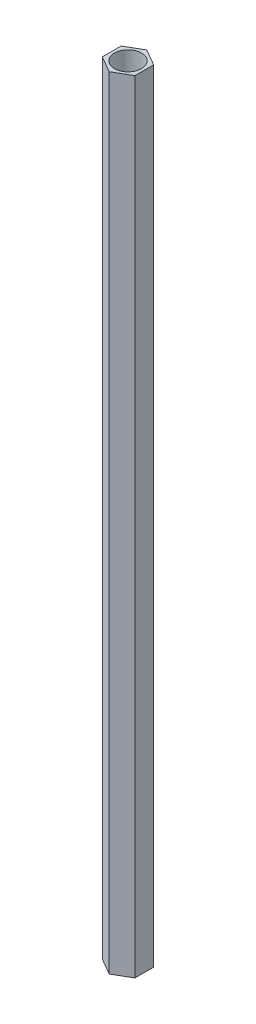
ISO-10303-21;
HEADER;
FILE_DESCRIPTION(('STEP AP214'),'2;1');
FILE_NAME('part.step','',(''),(''),'','','');
FILE_SCHEMA(('AUTOMOTIVE_DESIGN { 1 0 10303 214 1 1 1 1 }'));
ENDSEC;
DATA;
#1=APPLICATION_CONTEXT('core data for automotive mechanical design processes');
#2=APPLICATION_PROTOCOL_DEFINITION('international standard','automotive_design',2000,#1);
#3=PRODUCT_CONTEXT('',#1,'mechanical');
#4=PRODUCT('Part','Part','',(#3));
#5=PRODUCT_RELATED_PRODUCT_CATEGORY('part','',(#4));
#6=PRODUCT_DEFINITION_FORMATION('','',#4);
#7=PRODUCT_DEFINITION_CONTEXT('part definition',#1,'design');
#8=PRODUCT_DEFINITION('design','',#6,#7);
#9=PRODUCT_DEFINITION_SHAPE('','',#8);
#10=(LENGTH_UNIT() NAMED_UNIT(*) SI_UNIT(.MILLI.,.METRE.));
#11=(NAMED_UNIT(*) PLANE_ANGLE_UNIT() SI_UNIT($,.RADIAN.));
#12=(NAMED_UNIT(*) SI_UNIT($,.STERADIAN.) SOLID_ANGLE_UNIT());
#13=UNCERTAINTY_MEASURE_WITH_UNIT(LENGTH_MEASURE(1.E-05),#10,'distance_accuracy_value','');
#14=(GEOMETRIC_REPRESENTATION_CONTEXT(3) GLOBAL_UNCERTAINTY_ASSIGNED_CONTEXT((#13)) GLOBAL_UNIT_ASSIGNED_CONTEXT((#10,
#11,#12)) REPRESENTATION_CONTEXT('',''));
#15=CARTESIAN_POINT('',(0.,0.,0.));
#16=DIRECTION('',(0.,0.,1.));
#17=DIRECTION('',(1.,0.,0.));
#18=AXIS2_PLACEMENT_3D('',#15,#16,#17);
#19=CARTESIAN_POINT('',(1.5,72.,-0.86602540378444));
#20=DIRECTION('',(-0.5,0.,0.866025403784439));
#21=DIRECTION('',(0.866025403784439,0.,0.5));
#22=AXIS2_PLACEMENT_3D('',#19,#20,#21);
#23=PLANE('',#22);
#24=DIRECTION('',(-0.866025403784439,0.,-0.5));
#25=VECTOR('',#24,1.);
#26=CARTESIAN_POINT('',(1.5,0.,-0.86602540378444));
#27=LINE('',#26,#25);
#28=CARTESIAN_POINT('',(1.5,0.,-0.86602540378444));
#29=VERTEX_POINT('',#28);
#30=CARTESIAN_POINT('',(0.,0.,-1.73205080756888));
#31=VERTEX_POINT('',#30);
#32=EDGE_CURVE('E124',#29,#31,#27,.T.);
#33=ORIENTED_EDGE('',*,*,#32,.T.);
#34=DIRECTION('',(0.,-1.,0.));
#35=VECTOR('',#34,1.);
#36=CARTESIAN_POINT('',(0.,72.,-1.73205080756888));
#37=LINE('',#36,#35);
#38=CARTESIAN_POINT('',(0.,72.,-1.73205080756888));
#39=VERTEX_POINT('',#38);
#40=EDGE_CURVE('E11',#39,#31,#37,.T.);
#41=ORIENTED_EDGE('',*,*,#40,.F.);
#42=DIRECTION('',(-0.866025403784439,0.,-0.5));
#43=VECTOR('',#42,1.);
#44=CARTESIAN_POINT('',(1.5,72.,-0.86602540378444));
#45=LINE('',#44,#43);
#46=CARTESIAN_POINT('',(1.5,72.,-0.86602540378444));
#47=VERTEX_POINT('',#46);
#48=EDGE_CURVE('E135',#47,#39,#45,.T.);
#49=ORIENTED_EDGE('',*,*,#48,.F.);
#50=DIRECTION('',(0.,-1.,0.));
#51=VECTOR('',#50,1.);
#52=CARTESIAN_POINT('',(1.5,72.,-0.86602540378444));
#53=LINE('',#52,#51);
#54=EDGE_CURVE('E120',#47,#29,#53,.T.);
#55=ORIENTED_EDGE('',*,*,#54,.T.);
#56=EDGE_LOOP('',(#33,#41,#49,#55));
#57=FACE_BOUND('',#56,.T.);
#58=ADVANCED_FACE('F37',(#57),#23,.F.);
#59=CARTESIAN_POINT('',(0.,72.,-1.73205080756888));
#60=DIRECTION('',(0.5,0.,0.866025403784439));
#61=DIRECTION('',(0.866025403784439,0.,-0.5));
#62=AXIS2_PLACEMENT_3D('',#59,#60,#61);
#63=PLANE('',#62);
#64=DIRECTION('',(-0.866025403784439,0.,0.5));
#65=VECTOR('',#64,1.);
#66=CARTESIAN_POINT('',(0.,0.,-1.73205080756888));
#67=LINE('',#66,#65);
#68=CARTESIAN_POINT('',(-1.5,0.,-0.866025403784439));
#69=VERTEX_POINT('',#68);
#70=EDGE_CURVE('E127',#31,#69,#67,.T.);
#71=ORIENTED_EDGE('',*,*,#70,.T.);
#72=DIRECTION('',(0.,-1.,0.));
#73=VECTOR('',#72,1.);
#74=CARTESIAN_POINT('',(-1.5,72.,-0.866025403784439));
#75=LINE('',#74,#73);
#76=CARTESIAN_POINT('',(-1.5,72.,-0.866025403784439));
#77=VERTEX_POINT('',#76);
#78=EDGE_CURVE('E45',#77,#69,#75,.T.);
#79=ORIENTED_EDGE('',*,*,#78,.F.);
#80=DIRECTION('',(-0.866025403784439,0.,0.5));
#81=VECTOR('',#80,1.);
#82=CARTESIAN_POINT('',(0.,72.,-1.73205080756888));
#83=LINE('',#82,#81);
#84=EDGE_CURVE('E91',#39,#77,#83,.T.);
#85=ORIENTED_EDGE('',*,*,#84,.F.);
#86=ORIENTED_EDGE('',*,*,#40,.T.);
#87=EDGE_LOOP('',(#71,#79,#85,#86));
#88=FACE_BOUND('',#87,.T.);
#89=ADVANCED_FACE('F160',(#88),#63,.F.);
#90=CARTESIAN_POINT('',(-1.5,72.,-0.866025403784439));
#91=DIRECTION('',(1.,0.,0.));
#92=DIRECTION('',(0.,0.,-1.));
#93=AXIS2_PLACEMENT_3D('',#90,#91,#92);
#94=PLANE('',#93);
#95=DIRECTION('',(0.,0.,1.));
#96=VECTOR('',#95,1.);
#97=CARTESIAN_POINT('',(-1.5,0.,-0.866025403784439));
#98=LINE('',#97,#96);
#99=CARTESIAN_POINT('',(-1.5,0.,0.866025403784439));
#100=VERTEX_POINT('',#99);
#101=EDGE_CURVE('E130',#69,#100,#98,.T.);
#102=ORIENTED_EDGE('',*,*,#101,.T.);
#103=DIRECTION('',(0.,-1.,0.));
#104=VECTOR('',#103,1.);
#105=CARTESIAN_POINT('',(-1.5,72.,0.866025403784439));
#106=LINE('',#105,#104);
#107=CARTESIAN_POINT('',(-1.5,72.,0.866025403784439));
#108=VERTEX_POINT('',#107);
#109=EDGE_CURVE('E115',#108,#100,#106,.T.);
#110=ORIENTED_EDGE('',*,*,#109,.F.);
#111=DIRECTION('',(0.,0.,1.));
#112=VECTOR('',#111,1.);
#113=CARTESIAN_POINT('',(-1.5,72.,-0.866025403784439));
#114=LINE('',#113,#112);
#115=EDGE_CURVE('E106',#77,#108,#114,.T.);
#116=ORIENTED_EDGE('',*,*,#115,.F.);
#117=ORIENTED_EDGE('',*,*,#78,.T.);
#118=EDGE_LOOP('',(#102,#110,#116,#117));
#119=FACE_BOUND('',#118,.T.);
#120=ADVANCED_FACE('F141',(#119),#94,.F.);
#121=CARTESIAN_POINT('',(-1.5,72.,0.866025403784439));
#122=DIRECTION('',(0.5,0.,-0.866025403784439));
#123=DIRECTION('',(-0.866025403784439,0.,-0.5));
#124=AXIS2_PLACEMENT_3D('',#121,#122,#123);
#125=PLANE('',#124);
#126=DIRECTION('',(0.866025403784439,0.,0.5));
#127=VECTOR('',#126,1.);
#128=CARTESIAN_POINT('',(-1.5,0.,0.866025403784439));
#129=LINE('',#128,#127);
#130=CARTESIAN_POINT('',(0.,0.,1.73205080756888));
#131=VERTEX_POINT('',#130);
#132=EDGE_CURVE('E114',#100,#131,#129,.T.);
#133=ORIENTED_EDGE('',*,*,#132,.T.);
#134=DIRECTION('',(0.,-1.,0.));
#135=VECTOR('',#134,1.);
#136=CARTESIAN_POINT('',(0.,72.,1.73205080756888));
#137=LINE('',#136,#135);
#138=CARTESIAN_POINT('',(0.,72.,1.73205080756888));
#139=VERTEX_POINT('',#138);
#140=EDGE_CURVE('E111',#139,#131,#137,.T.);
#141=ORIENTED_EDGE('',*,*,#140,.F.);
#142=DIRECTION('',(0.866025403784439,0.,0.5));
#143=VECTOR('',#142,1.);
#144=CARTESIAN_POINT('',(-1.5,72.,0.866025403784439));
#145=LINE('',#144,#143);
#146=EDGE_CURVE('E100',#108,#139,#145,.T.);
#147=ORIENTED_EDGE('',*,*,#146,.F.);
#148=ORIENTED_EDGE('',*,*,#109,.T.);
#149=EDGE_LOOP('',(#133,#141,#147,#148));
#150=FACE_BOUND('',#149,.T.);
#151=ADVANCED_FACE('F112',(#150),#125,.F.);
#152=CARTESIAN_POINT('',(0.,72.,1.73205080756888));
#153=DIRECTION('',(-0.5,0.,-0.866025403784439));
#154=DIRECTION('',(-0.866025403784439,0.,0.5));
#155=AXIS2_PLACEMENT_3D('',#152,#153,#154);
#156=PLANE('',#155);
#157=DIRECTION('',(0.866025403784439,0.,-0.5));
#158=VECTOR('',#157,1.);
#159=CARTESIAN_POINT('',(0.,0.,1.73205080756888));
#160=LINE('',#159,#158);
#161=CARTESIAN_POINT('',(1.5,0.,0.866025403784439));
#162=VERTEX_POINT('',#161);
#163=EDGE_CURVE('E77',#131,#162,#160,.T.);
#164=ORIENTED_EDGE('',*,*,#163,.T.);
#165=DIRECTION('',(0.,-1.,0.));
#166=VECTOR('',#165,1.);
#167=CARTESIAN_POINT('',(1.5,72.,0.866025403784439));
#168=LINE('',#167,#166);
#169=CARTESIAN_POINT('',(1.5,72.,0.866025403784439));
#170=VERTEX_POINT('',#169);
#171=EDGE_CURVE('E116',#170,#162,#168,.T.);
#172=ORIENTED_EDGE('',*,*,#171,.F.);
#173=DIRECTION('',(0.866025403784439,0.,-0.5));
#174=VECTOR('',#173,1.);
#175=CARTESIAN_POINT('',(0.,72.,1.73205080756888));
#176=LINE('',#175,#174);
#177=EDGE_CURVE('E104',#139,#170,#176,.T.);
#178=ORIENTED_EDGE('',*,*,#177,.F.);
#179=ORIENTED_EDGE('',*,*,#140,.T.);
#180=EDGE_LOOP('',(#164,#172,#178,#179));
#181=FACE_BOUND('',#180,.T.);
#182=ADVANCED_FACE('F118',(#181),#156,.F.);
#183=CARTESIAN_POINT('',(1.5,72.,0.866025403784439));
#184=DIRECTION('',(-1.,0.,0.));
#185=DIRECTION('',(0.,0.,1.));
#186=AXIS2_PLACEMENT_3D('',#183,#184,#185);
#187=PLANE('',#186);
#188=DIRECTION('',(0.,0.,-1.));
#189=VECTOR('',#188,1.);
#190=CARTESIAN_POINT('',(1.5,0.,0.866025403784439));
#191=LINE('',#190,#189);
#192=EDGE_CURVE('E83',#162,#29,#191,.T.);
#193=ORIENTED_EDGE('',*,*,#192,.T.);
#194=ORIENTED_EDGE('',*,*,#54,.F.);
#195=DIRECTION('',(0.,0.,-1.));
#196=VECTOR('',#195,1.);
#197=CARTESIAN_POINT('',(1.5,72.,0.866025403784439));
#198=LINE('',#197,#196);
#199=EDGE_CURVE('E53',#170,#47,#198,.T.);
#200=ORIENTED_EDGE('',*,*,#199,.F.);
#201=ORIENTED_EDGE('',*,*,#171,.T.);
#202=EDGE_LOOP('',(#193,#194,#200,#201));
#203=FACE_BOUND('',#202,.T.);
#204=ADVANCED_FACE('F148',(#203),#187,.F.);
#205=CARTESIAN_POINT('',(0.,72.,0.));
#206=DIRECTION('',(0.,1.,0.));
#207=DIRECTION('',(0.,0.,1.));
#208=AXIS2_PLACEMENT_3D('',#205,#206,#207);
#209=PLANE('',#208);
#210=CARTESIAN_POINT('',(0.,72.,0.));
#211=DIRECTION('',(0.,1.,0.));
#212=DIRECTION('',(0.,0.,1.));
#213=AXIS2_PLACEMENT_3D('',#210,#211,#212);
#214=CIRCLE('',#213,1.24999999999999);
#215=CARTESIAN_POINT('',(0.,72.,1.24999999999999));
#216=VERTEX_POINT('',#215);
#217=EDGE_CURVE('E248',#216,#216,#214,.T.);
#218=ORIENTED_EDGE('',*,*,#217,.F.);
#219=EDGE_LOOP('',(#218));
#220=FACE_BOUND('',#219,.T.);
#221=ORIENTED_EDGE('',*,*,#48,.T.);
#222=ORIENTED_EDGE('',*,*,#84,.T.);
#223=ORIENTED_EDGE('',*,*,#115,.T.);
#224=ORIENTED_EDGE('',*,*,#146,.T.);
#225=ORIENTED_EDGE('',*,*,#177,.T.);
#226=ORIENTED_EDGE('',*,*,#199,.T.);
#227=EDGE_LOOP('',(#221,#222,#223,#224,#225,#226));
#228=FACE_BOUND('',#227,.T.);
#229=ADVANCED_FACE('F102',(#220,#228),#209,.T.);
#230=CARTESIAN_POINT('',(0.,0.,0.));
#231=DIRECTION('',(0.,1.,0.));
#232=DIRECTION('',(0.,0.,1.));
#233=AXIS2_PLACEMENT_3D('',#230,#231,#232);
#234=PLANE('',#233);
#235=CARTESIAN_POINT('',(0.,0.,0.));
#236=DIRECTION('',(0.,-1.,0.));
#237=DIRECTION('',(0.,0.,-1.));
#238=AXIS2_PLACEMENT_3D('',#235,#236,#237);
#239=CIRCLE('',#238,1.24999999999999);
#240=CARTESIAN_POINT('',(0.,0.,-1.24999999999999));
#241=VERTEX_POINT('',#240);
#242=EDGE_CURVE('E246',#241,#241,#239,.T.);
#243=ORIENTED_EDGE('',*,*,#242,.F.);
#244=EDGE_LOOP('',(#243));
#245=FACE_BOUND('',#244,.T.);
#246=ORIENTED_EDGE('',*,*,#32,.F.);
#247=ORIENTED_EDGE('',*,*,#192,.F.);
#248=ORIENTED_EDGE('',*,*,#163,.F.);
#249=ORIENTED_EDGE('',*,*,#132,.F.);
#250=ORIENTED_EDGE('',*,*,#101,.F.);
#251=ORIENTED_EDGE('',*,*,#70,.F.);
#252=EDGE_LOOP('',(#246,#247,#248,#249,#250,#251));
#253=FACE_BOUND('',#252,.T.);
#254=ADVANCED_FACE('F144',(#245,#253),#234,.F.);
#255=CARTESIAN_POINT('',(0.,62.,0.));
#256=DIRECTION('',(0.,1.,0.));
#257=DIRECTION('',(0.,0.,1.));
#258=AXIS2_PLACEMENT_3D('',#255,#256,#257);
#259=CONICAL_SURFACE('',#258,1.25,1.02974425867665);
#260=CARTESIAN_POINT('',(0.,61.2489242262155,0.));
#261=VERTEX_POINT('',#260);
#262=VERTEX_LOOP('',#261);
#263=FACE_BOUND('',#262,.T.);
#264=CARTESIAN_POINT('',(0.,62.,0.));
#265=DIRECTION('',(0.,1.,0.));
#266=DIRECTION('',(0.,0.,1.));
#267=AXIS2_PLACEMENT_3D('',#264,#265,#266);
#268=CIRCLE('',#267,1.25);
#269=CARTESIAN_POINT('',(0.,62.,1.25));
#270=VERTEX_POINT('',#269);
#271=EDGE_CURVE('E128',#270,#270,#268,.T.);
#272=ORIENTED_EDGE('',*,*,#271,.T.);
#273=EDGE_LOOP('',(#272));
#274=FACE_BOUND('',#273,.T.);
#275=ADVANCED_FACE('F195',(#263,#274),#259,.F.);
#276=CARTESIAN_POINT('',(0.,72.,0.));
#277=DIRECTION('',(0.,1.,0.));
#278=DIRECTION('',(0.,0.,1.));
#279=AXIS2_PLACEMENT_3D('',#276,#277,#278);
#280=CYLINDRICAL_SURFACE('',#279,1.24999999999999);
#281=ORIENTED_EDGE('',*,*,#271,.F.);
#282=EDGE_LOOP('',(#281));
#283=FACE_BOUND('',#282,.T.);
#284=ORIENTED_EDGE('',*,*,#217,.T.);
#285=EDGE_LOOP('',(#284));
#286=FACE_BOUND('',#285,.T.);
#287=ADVANCED_FACE('F200',(#283,#286),#280,.F.);
#288=CARTESIAN_POINT('',(0.,9.99999999999999,0.));
#289=DIRECTION('',(0.,-1.,0.));
#290=DIRECTION('',(0.,0.,-1.));
#291=AXIS2_PLACEMENT_3D('',#288,#289,#290);
#292=CONICAL_SURFACE('',#291,1.24999999999999,1.02974425867665);
#293=CARTESIAN_POINT('',(0.,10.7510757737845,0.));
#294=VERTEX_POINT('',#293);
#295=VERTEX_LOOP('',#294);
#296=FACE_BOUND('',#295,.T.);
#297=CARTESIAN_POINT('',(0.,9.99999999999999,0.));
#298=DIRECTION('',(0.,-1.,0.));
#299=DIRECTION('',(0.,0.,-1.));
#300=AXIS2_PLACEMENT_3D('',#297,#298,#299);
#301=CIRCLE('',#300,1.24999999999999);
#302=CARTESIAN_POINT('',(0.,9.99999999999999,-1.24999999999999));
#303=VERTEX_POINT('',#302);
#304=EDGE_CURVE('E243',#303,#303,#301,.T.);
#305=ORIENTED_EDGE('',*,*,#304,.T.);
#306=EDGE_LOOP('',(#305));
#307=FACE_BOUND('',#306,.T.);
#308=ADVANCED_FACE('F210',(#296,#307),#292,.F.);
#309=CARTESIAN_POINT('',(0.,0.,0.));
#310=DIRECTION('',(0.,-1.,0.));
#311=DIRECTION('',(0.,0.,-1.));
#312=AXIS2_PLACEMENT_3D('',#309,#310,#311);
#313=CYLINDRICAL_SURFACE('',#312,1.24999999999999);
#314=ORIENTED_EDGE('',*,*,#304,.F.);
#315=EDGE_LOOP('',(#314));
#316=FACE_BOUND('',#315,.T.);
#317=ORIENTED_EDGE('',*,*,#242,.T.);
#318=EDGE_LOOP('',(#317));
#319=FACE_BOUND('',#318,.T.);
#320=ADVANCED_FACE('F226',(#316,#319),#313,.F.);
#321=CLOSED_SHELL('',(#58,#89,#120,#151,#182,#204,#229,#254,#275,#287,#308,#320));
#322=MANIFOLD_SOLID_BREP('B2',#321);
#323=ADVANCED_BREP_SHAPE_REPRESENTATION('',(#18,#322),#14);
#324=SHAPE_DEFINITION_REPRESENTATION(#9,#323);
ENDSEC;
END-ISO-10303-21;
